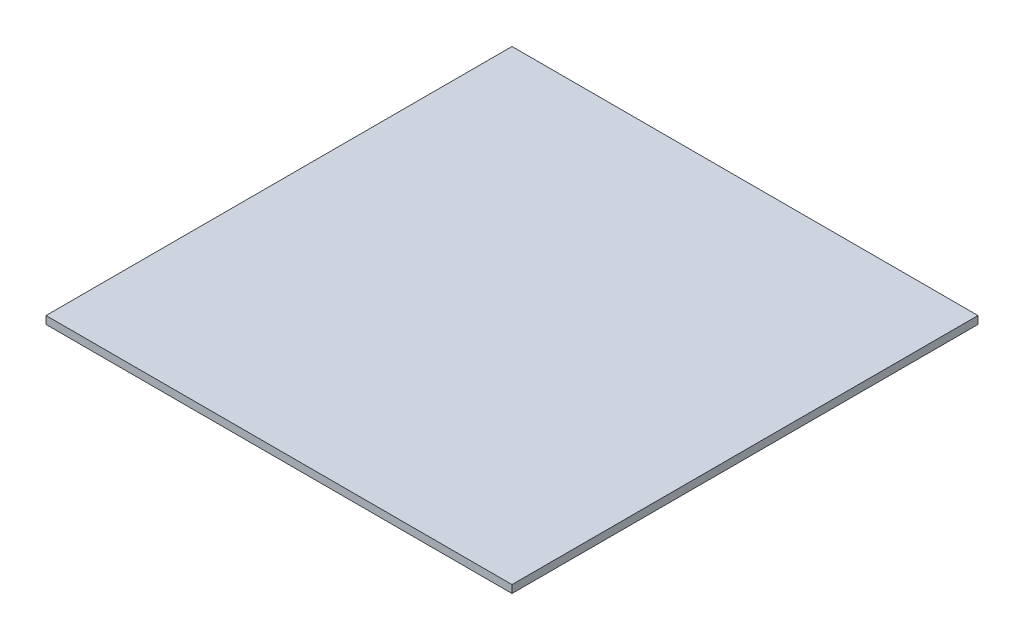
ISO-10303-21;
HEADER;
FILE_DESCRIPTION(('STEP AP214'),'2;1');
FILE_NAME('part.step','',(''),(''),'','','');
FILE_SCHEMA(('AUTOMOTIVE_DESIGN { 1 0 10303 214 1 1 1 1 }'));
ENDSEC;
DATA;
#1=APPLICATION_CONTEXT('core data for automotive mechanical design processes');
#2=APPLICATION_PROTOCOL_DEFINITION('international standard','automotive_design',2000,#1);
#3=PRODUCT_CONTEXT('',#1,'mechanical');
#4=PRODUCT('Part','Part','',(#3));
#5=PRODUCT_RELATED_PRODUCT_CATEGORY('part','',(#4));
#6=PRODUCT_DEFINITION_FORMATION('','',#4);
#7=PRODUCT_DEFINITION_CONTEXT('part definition',#1,'design');
#8=PRODUCT_DEFINITION('design','',#6,#7);
#9=PRODUCT_DEFINITION_SHAPE('','',#8);
#10=(LENGTH_UNIT() NAMED_UNIT(*) SI_UNIT(.MILLI.,.METRE.));
#11=(NAMED_UNIT(*) PLANE_ANGLE_UNIT() SI_UNIT($,.RADIAN.));
#12=(NAMED_UNIT(*) SI_UNIT($,.STERADIAN.) SOLID_ANGLE_UNIT());
#13=UNCERTAINTY_MEASURE_WITH_UNIT(LENGTH_MEASURE(1.E-05),#10,'distance_accuracy_value','');
#14=(GEOMETRIC_REPRESENTATION_CONTEXT(3) GLOBAL_UNCERTAINTY_ASSIGNED_CONTEXT((#13)) GLOBAL_UNIT_ASSIGNED_CONTEXT((#10,
#11,#12)) REPRESENTATION_CONTEXT('',''));
#15=CARTESIAN_POINT('',(0.,0.,0.));
#16=DIRECTION('',(0.,0.,1.));
#17=DIRECTION('',(1.,0.,0.));
#18=AXIS2_PLACEMENT_3D('',#15,#16,#17);
#19=CARTESIAN_POINT('',(152.4,5.08,152.4));
#20=DIRECTION('',(-1.,0.,0.));
#21=DIRECTION('',(0.,0.,1.));
#22=AXIS2_PLACEMENT_3D('',#19,#20,#21);
#23=PLANE('',#22);
#24=DIRECTION('',(0.,0.,-1.));
#25=VECTOR('',#24,1.);
#26=CARTESIAN_POINT('',(152.4,0.,152.4));
#27=LINE('',#26,#25);
#28=CARTESIAN_POINT('',(152.4,0.,152.4));
#29=VERTEX_POINT('',#28);
#30=CARTESIAN_POINT('',(152.4,0.,-152.4));
#31=VERTEX_POINT('',#30);
#32=EDGE_CURVE('E107',#29,#31,#27,.T.);
#33=ORIENTED_EDGE('',*,*,#32,.T.);
#34=DIRECTION('',(0.,-1.,0.));
#35=VECTOR('',#34,1.);
#36=CARTESIAN_POINT('',(152.4,5.08,-152.4));
#37=LINE('',#36,#35);
#38=CARTESIAN_POINT('',(152.4,5.08,-152.4));
#39=VERTEX_POINT('',#38);
#40=EDGE_CURVE('E11',#39,#31,#37,.T.);
#41=ORIENTED_EDGE('',*,*,#40,.F.);
#42=DIRECTION('',(0.,0.,-1.));
#43=VECTOR('',#42,1.);
#44=CARTESIAN_POINT('',(152.4,5.08,152.4));
#45=LINE('',#44,#43);
#46=CARTESIAN_POINT('',(152.4,5.08,152.4));
#47=VERTEX_POINT('',#46);
#48=EDGE_CURVE('E91',#47,#39,#45,.T.);
#49=ORIENTED_EDGE('',*,*,#48,.F.);
#50=DIRECTION('',(0.,-1.,0.));
#51=VECTOR('',#50,1.);
#52=CARTESIAN_POINT('',(152.4,5.08,152.4));
#53=LINE('',#52,#51);
#54=EDGE_CURVE('E103',#47,#29,#53,.T.);
#55=ORIENTED_EDGE('',*,*,#54,.T.);
#56=EDGE_LOOP('',(#33,#41,#49,#55));
#57=FACE_BOUND('',#56,.T.);
#58=ADVANCED_FACE('F39',(#57),#23,.F.);
#59=CARTESIAN_POINT('',(-152.4,5.08,-152.4));
#60=DIRECTION('',(0.,0.,1.));
#61=DIRECTION('',(1.,0.,0.));
#62=AXIS2_PLACEMENT_3D('',#59,#60,#61);
#63=PLANE('',#62);
#64=DIRECTION('',(-1.,0.,0.));
#65=VECTOR('',#64,1.);
#66=CARTESIAN_POINT('',(-152.4,0.,-152.4));
#67=LINE('',#66,#65);
#68=CARTESIAN_POINT('',(-152.4,0.,-152.4));
#69=VERTEX_POINT('',#68);
#70=EDGE_CURVE('E96',#31,#69,#67,.T.);
#71=ORIENTED_EDGE('',*,*,#70,.T.);
#72=DIRECTION('',(0.,-1.,0.));
#73=VECTOR('',#72,1.);
#74=CARTESIAN_POINT('',(-152.4,5.08,-152.4));
#75=LINE('',#74,#73);
#76=CARTESIAN_POINT('',(-152.4,5.08,-152.4));
#77=VERTEX_POINT('',#76);
#78=EDGE_CURVE('E48',#77,#69,#75,.T.);
#79=ORIENTED_EDGE('',*,*,#78,.F.);
#80=DIRECTION('',(-1.,0.,0.));
#81=VECTOR('',#80,1.);
#82=CARTESIAN_POINT('',(-152.4,5.08,-152.4));
#83=LINE('',#82,#81);
#84=EDGE_CURVE('E86',#39,#77,#83,.T.);
#85=ORIENTED_EDGE('',*,*,#84,.F.);
#86=ORIENTED_EDGE('',*,*,#40,.T.);
#87=EDGE_LOOP('',(#71,#79,#85,#86));
#88=FACE_BOUND('',#87,.T.);
#89=ADVANCED_FACE('F95',(#88),#63,.F.);
#90=CARTESIAN_POINT('',(-152.4,5.08,152.4));
#91=DIRECTION('',(1.,0.,0.));
#92=DIRECTION('',(0.,0.,-1.));
#93=AXIS2_PLACEMENT_3D('',#90,#91,#92);
#94=PLANE('',#93);
#95=DIRECTION('',(0.,0.,1.));
#96=VECTOR('',#95,1.);
#97=CARTESIAN_POINT('',(-152.4,0.,152.4));
#98=LINE('',#97,#96);
#99=CARTESIAN_POINT('',(-152.4,0.,152.4));
#100=VERTEX_POINT('',#99);
#101=EDGE_CURVE('E73',#69,#100,#98,.T.);
#102=ORIENTED_EDGE('',*,*,#101,.T.);
#103=DIRECTION('',(0.,-1.,0.));
#104=VECTOR('',#103,1.);
#105=CARTESIAN_POINT('',(-152.4,5.08,152.4));
#106=LINE('',#105,#104);
#107=CARTESIAN_POINT('',(-152.4,5.08,152.4));
#108=VERTEX_POINT('',#107);
#109=EDGE_CURVE('E98',#108,#100,#106,.T.);
#110=ORIENTED_EDGE('',*,*,#109,.F.);
#111=DIRECTION('',(0.,0.,1.));
#112=VECTOR('',#111,1.);
#113=CARTESIAN_POINT('',(-152.4,5.08,152.4));
#114=LINE('',#113,#112);
#115=EDGE_CURVE('E89',#77,#108,#114,.T.);
#116=ORIENTED_EDGE('',*,*,#115,.F.);
#117=ORIENTED_EDGE('',*,*,#78,.T.);
#118=EDGE_LOOP('',(#102,#110,#116,#117));
#119=FACE_BOUND('',#118,.T.);
#120=ADVANCED_FACE('F99',(#119),#94,.F.);
#121=CARTESIAN_POINT('',(-152.4,5.08,152.4));
#122=DIRECTION('',(0.,0.,-1.));
#123=DIRECTION('',(-1.,0.,0.));
#124=AXIS2_PLACEMENT_3D('',#121,#122,#123);
#125=PLANE('',#124);
#126=DIRECTION('',(1.,0.,0.));
#127=VECTOR('',#126,1.);
#128=CARTESIAN_POINT('',(-152.4,0.,152.4));
#129=LINE('',#128,#127);
#130=EDGE_CURVE('E79',#100,#29,#129,.T.);
#131=ORIENTED_EDGE('',*,*,#130,.T.);
#132=ORIENTED_EDGE('',*,*,#54,.F.);
#133=DIRECTION('',(1.,0.,0.));
#134=VECTOR('',#133,1.);
#135=CARTESIAN_POINT('',(-152.4,5.08,152.4));
#136=LINE('',#135,#134);
#137=EDGE_CURVE('E56',#108,#47,#136,.T.);
#138=ORIENTED_EDGE('',*,*,#137,.F.);
#139=ORIENTED_EDGE('',*,*,#109,.T.);
#140=EDGE_LOOP('',(#131,#132,#138,#139));
#141=FACE_BOUND('',#140,.T.);
#142=ADVANCED_FACE('F120',(#141),#125,.F.);
#143=CARTESIAN_POINT('',(0.,5.08,0.));
#144=DIRECTION('',(0.,-1.,0.));
#145=DIRECTION('',(0.,0.,-1.));
#146=AXIS2_PLACEMENT_3D('',#143,#144,#145);
#147=PLANE('',#146);
#148=ORIENTED_EDGE('',*,*,#48,.T.);
#149=ORIENTED_EDGE('',*,*,#84,.T.);
#150=ORIENTED_EDGE('',*,*,#115,.T.);
#151=ORIENTED_EDGE('',*,*,#137,.T.);
#152=EDGE_LOOP('',(#148,#149,#150,#151));
#153=FACE_BOUND('',#152,.T.);
#154=ADVANCED_FACE('F87',(#153),#147,.F.);
#155=CARTESIAN_POINT('',(0.,0.,0.));
#156=DIRECTION('',(0.,-1.,0.));
#157=DIRECTION('',(0.,0.,-1.));
#158=AXIS2_PLACEMENT_3D('',#155,#156,#157);
#159=PLANE('',#158);
#160=ORIENTED_EDGE('',*,*,#32,.F.);
#161=ORIENTED_EDGE('',*,*,#130,.F.);
#162=ORIENTED_EDGE('',*,*,#101,.F.);
#163=ORIENTED_EDGE('',*,*,#70,.F.);
#164=EDGE_LOOP('',(#160,#161,#162,#163));
#165=FACE_BOUND('',#164,.T.);
#166=ADVANCED_FACE('F123',(#165),#159,.T.);
#167=CLOSED_SHELL('',(#58,#89,#120,#142,#154,#166));
#168=MANIFOLD_SOLID_BREP('B2',#167);
#169=ADVANCED_BREP_SHAPE_REPRESENTATION('',(#18,#168),#14);
#170=SHAPE_DEFINITION_REPRESENTATION(#9,#169);
ENDSEC;
END-ISO-10303-21;
